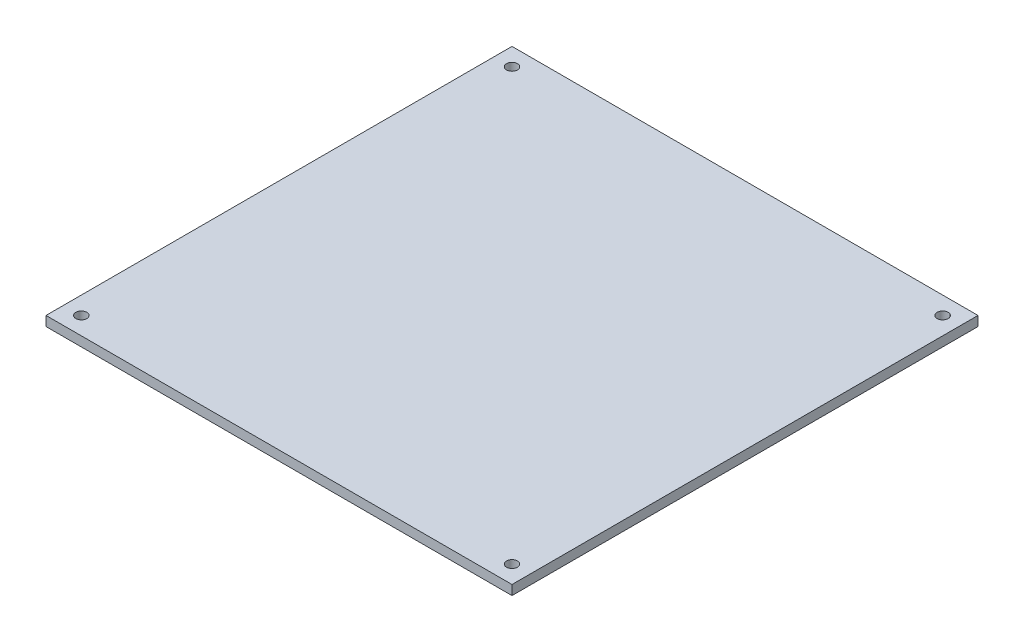
ISO-10303-21;
HEADER;
FILE_DESCRIPTION(('STEP AP214'),'2;1');
FILE_NAME('part.step','',(''),(''),'','','');
FILE_SCHEMA(('AUTOMOTIVE_DESIGN { 1 0 10303 214 1 1 1 1 }'));
ENDSEC;
DATA;
#1=APPLICATION_CONTEXT('core data for automotive mechanical design processes');
#2=APPLICATION_PROTOCOL_DEFINITION('international standard','automotive_design',2000,#1);
#3=PRODUCT_CONTEXT('',#1,'mechanical');
#4=PRODUCT('Part','Part','',(#3));
#5=PRODUCT_RELATED_PRODUCT_CATEGORY('part','',(#4));
#6=PRODUCT_DEFINITION_FORMATION('','',#4);
#7=PRODUCT_DEFINITION_CONTEXT('part definition',#1,'design');
#8=PRODUCT_DEFINITION('design','',#6,#7);
#9=PRODUCT_DEFINITION_SHAPE('','',#8);
#10=(LENGTH_UNIT() NAMED_UNIT(*) SI_UNIT(.MILLI.,.METRE.));
#11=(NAMED_UNIT(*) PLANE_ANGLE_UNIT() SI_UNIT($,.RADIAN.));
#12=(NAMED_UNIT(*) SI_UNIT($,.STERADIAN.) SOLID_ANGLE_UNIT());
#13=UNCERTAINTY_MEASURE_WITH_UNIT(LENGTH_MEASURE(1.E-05),#10,'distance_accuracy_value','');
#14=(GEOMETRIC_REPRESENTATION_CONTEXT(3) GLOBAL_UNCERTAINTY_ASSIGNED_CONTEXT((#13)) GLOBAL_UNIT_ASSIGNED_CONTEXT((#10,
#11,#12)) REPRESENTATION_CONTEXT('',''));
#15=CARTESIAN_POINT('',(0.,0.,0.));
#16=DIRECTION('',(0.,0.,1.));
#17=DIRECTION('',(1.,0.,0.));
#18=AXIS2_PLACEMENT_3D('',#15,#16,#17);
#19=CARTESIAN_POINT('',(0.,3.,0.));
#20=DIRECTION('',(1.,0.,0.));
#21=DIRECTION('',(0.,0.,-1.));
#22=AXIS2_PLACEMENT_3D('',#19,#20,#21);
#23=PLANE('',#22);
#24=DIRECTION('',(0.,0.,1.));
#25=VECTOR('',#24,1.);
#26=CARTESIAN_POINT('',(0.,0.,0.));
#27=LINE('',#26,#25);
#28=CARTESIAN_POINT('',(0.,0.,-145.));
#29=VERTEX_POINT('',#28);
#30=CARTESIAN_POINT('',(0.,0.,0.));
#31=VERTEX_POINT('',#30);
#32=EDGE_CURVE('E96',#29,#31,#27,.T.);
#33=ORIENTED_EDGE('',*,*,#32,.T.);
#34=DIRECTION('',(0.,-1.,0.));
#35=VECTOR('',#34,1.);
#36=CARTESIAN_POINT('',(0.,3.,0.));
#37=LINE('',#36,#35);
#38=CARTESIAN_POINT('',(0.,3.,0.));
#39=VERTEX_POINT('',#38);
#40=EDGE_CURVE('E11',#39,#31,#37,.T.);
#41=ORIENTED_EDGE('',*,*,#40,.F.);
#42=DIRECTION('',(0.,0.,1.));
#43=VECTOR('',#42,1.);
#44=CARTESIAN_POINT('',(0.,3.,0.));
#45=LINE('',#44,#43);
#46=CARTESIAN_POINT('',(0.,3.,-145.));
#47=VERTEX_POINT('',#46);
#48=EDGE_CURVE('E84',#47,#39,#45,.T.);
#49=ORIENTED_EDGE('',*,*,#48,.F.);
#50=DIRECTION('',(0.,-1.,0.));
#51=VECTOR('',#50,1.);
#52=CARTESIAN_POINT('',(0.,3.,-145.));
#53=LINE('',#52,#51);
#54=EDGE_CURVE('E92',#47,#29,#53,.T.);
#55=ORIENTED_EDGE('',*,*,#54,.T.);
#56=EDGE_LOOP('',(#33,#41,#49,#55));
#57=FACE_BOUND('',#56,.T.);
#58=ADVANCED_FACE('F33',(#57),#23,.F.);
#59=CARTESIAN_POINT('',(0.,3.,0.));
#60=DIRECTION('',(0.,0.,-1.));
#61=DIRECTION('',(-1.,0.,0.));
#62=AXIS2_PLACEMENT_3D('',#59,#60,#61);
#63=PLANE('',#62);
#64=DIRECTION('',(1.,0.,0.));
#65=VECTOR('',#64,1.);
#66=CARTESIAN_POINT('',(0.,0.,0.));
#67=LINE('',#66,#65);
#68=CARTESIAN_POINT('',(145.,0.,0.));
#69=VERTEX_POINT('',#68);
#70=EDGE_CURVE('E88',#31,#69,#67,.T.);
#71=ORIENTED_EDGE('',*,*,#70,.T.);
#72=DIRECTION('',(0.,-1.,0.));
#73=VECTOR('',#72,1.);
#74=CARTESIAN_POINT('',(145.,3.,0.));
#75=LINE('',#74,#73);
#76=CARTESIAN_POINT('',(145.,3.,0.));
#77=VERTEX_POINT('',#76);
#78=EDGE_CURVE('E41',#77,#69,#75,.T.);
#79=ORIENTED_EDGE('',*,*,#78,.F.);
#80=DIRECTION('',(1.,0.,0.));
#81=VECTOR('',#80,1.);
#82=CARTESIAN_POINT('',(0.,3.,0.));
#83=LINE('',#82,#81);
#84=EDGE_CURVE('E79',#39,#77,#83,.T.);
#85=ORIENTED_EDGE('',*,*,#84,.F.);
#86=ORIENTED_EDGE('',*,*,#40,.T.);
#87=EDGE_LOOP('',(#71,#79,#85,#86));
#88=FACE_BOUND('',#87,.T.);
#89=ADVANCED_FACE('F87',(#88),#63,.F.);
#90=CARTESIAN_POINT('',(145.,3.,0.));
#91=DIRECTION('',(-1.,0.,0.));
#92=DIRECTION('',(0.,0.,1.));
#93=AXIS2_PLACEMENT_3D('',#90,#91,#92);
#94=PLANE('',#93);
#95=DIRECTION('',(0.,0.,-1.));
#96=VECTOR('',#95,1.);
#97=CARTESIAN_POINT('',(145.,0.,0.));
#98=LINE('',#97,#96);
#99=CARTESIAN_POINT('',(145.,0.,-145.));
#100=VERTEX_POINT('',#99);
#101=EDGE_CURVE('E66',#69,#100,#98,.T.);
#102=ORIENTED_EDGE('',*,*,#101,.T.);
#103=DIRECTION('',(0.,-1.,0.));
#104=VECTOR('',#103,1.);
#105=CARTESIAN_POINT('',(145.,3.,-145.));
#106=LINE('',#105,#104);
#107=CARTESIAN_POINT('',(145.,3.,-145.));
#108=VERTEX_POINT('',#107);
#109=EDGE_CURVE('E89',#108,#100,#106,.T.);
#110=ORIENTED_EDGE('',*,*,#109,.F.);
#111=DIRECTION('',(0.,0.,-1.));
#112=VECTOR('',#111,1.);
#113=CARTESIAN_POINT('',(145.,3.,0.));
#114=LINE('',#113,#112);
#115=EDGE_CURVE('E82',#77,#108,#114,.T.);
#116=ORIENTED_EDGE('',*,*,#115,.F.);
#117=ORIENTED_EDGE('',*,*,#78,.T.);
#118=EDGE_LOOP('',(#102,#110,#116,#117));
#119=FACE_BOUND('',#118,.T.);
#120=ADVANCED_FACE('F90',(#119),#94,.F.);
#121=CARTESIAN_POINT('',(0.,3.,-145.));
#122=DIRECTION('',(0.,0.,1.));
#123=DIRECTION('',(1.,0.,0.));
#124=AXIS2_PLACEMENT_3D('',#121,#122,#123);
#125=PLANE('',#124);
#126=DIRECTION('',(-1.,0.,0.));
#127=VECTOR('',#126,1.);
#128=CARTESIAN_POINT('',(0.,0.,-145.));
#129=LINE('',#128,#127);
#130=EDGE_CURVE('E72',#100,#29,#129,.T.);
#131=ORIENTED_EDGE('',*,*,#130,.T.);
#132=ORIENTED_EDGE('',*,*,#54,.F.);
#133=DIRECTION('',(-1.,0.,0.));
#134=VECTOR('',#133,1.);
#135=CARTESIAN_POINT('',(0.,3.,-145.));
#136=LINE('',#135,#134);
#137=EDGE_CURVE('E49',#108,#47,#136,.T.);
#138=ORIENTED_EDGE('',*,*,#137,.F.);
#139=ORIENTED_EDGE('',*,*,#109,.T.);
#140=EDGE_LOOP('',(#131,#132,#138,#139));
#141=FACE_BOUND('',#140,.T.);
#142=ADVANCED_FACE('F104',(#141),#125,.F.);
#143=CARTESIAN_POINT('',(0.,3.,0.));
#144=DIRECTION('',(0.,-1.,0.));
#145=DIRECTION('',(0.,0.,-1.));
#146=AXIS2_PLACEMENT_3D('',#143,#144,#145);
#147=PLANE('',#146);
#148=CARTESIAN_POINT('',(139.5,3.,-5.50000000000001));
#149=DIRECTION('',(0.,1.,0.));
#150=DIRECTION('',(0.,0.,-1.));
#151=AXIS2_PLACEMENT_3D('',#148,#149,#150);
#152=CIRCLE('',#151,1.705);
#153=CARTESIAN_POINT('',(139.5,3.,-7.20500000000001));
#154=VERTEX_POINT('',#153);
#155=EDGE_CURVE('E123',#154,#154,#152,.T.);
#156=ORIENTED_EDGE('',*,*,#155,.F.);
#157=EDGE_LOOP('',(#156));
#158=FACE_BOUND('',#157,.T.);
#159=CARTESIAN_POINT('',(5.50000000000002,3.,-139.5));
#160=DIRECTION('',(0.,1.,0.));
#161=DIRECTION('',(0.,0.,-1.));
#162=AXIS2_PLACEMENT_3D('',#159,#160,#161);
#163=CIRCLE('',#162,1.705);
#164=CARTESIAN_POINT('',(5.50000000000002,3.,-141.205));
#165=VERTEX_POINT('',#164);
#166=EDGE_CURVE('E116',#165,#165,#163,.T.);
#167=ORIENTED_EDGE('',*,*,#166,.F.);
#168=EDGE_LOOP('',(#167));
#169=FACE_BOUND('',#168,.T.);
#170=CARTESIAN_POINT('',(139.5,3.,-139.5));
#171=DIRECTION('',(0.,1.,0.));
#172=DIRECTION('',(0.,0.,1.));
#173=AXIS2_PLACEMENT_3D('',#170,#171,#172);
#174=CIRCLE('',#173,1.70500000000001);
#175=CARTESIAN_POINT('',(139.5,3.,-137.795));
#176=VERTEX_POINT('',#175);
#177=EDGE_CURVE('E128',#176,#176,#174,.T.);
#178=ORIENTED_EDGE('',*,*,#177,.F.);
#179=EDGE_LOOP('',(#178));
#180=FACE_BOUND('',#179,.T.);
#181=CARTESIAN_POINT('',(5.50000000000002,3.,-5.50000000000001));
#182=DIRECTION('',(0.,1.,0.));
#183=DIRECTION('',(0.,0.,1.));
#184=AXIS2_PLACEMENT_3D('',#181,#182,#183);
#185=CIRCLE('',#184,1.705);
#186=CARTESIAN_POINT('',(5.50000000000002,3.,-3.79500000000001));
#187=VERTEX_POINT('',#186);
#188=EDGE_CURVE('E110',#187,#187,#185,.T.);
#189=ORIENTED_EDGE('',*,*,#188,.F.);
#190=EDGE_LOOP('',(#189));
#191=FACE_BOUND('',#190,.T.);
#192=ORIENTED_EDGE('',*,*,#48,.T.);
#193=ORIENTED_EDGE('',*,*,#84,.T.);
#194=ORIENTED_EDGE('',*,*,#115,.T.);
#195=ORIENTED_EDGE('',*,*,#137,.T.);
#196=EDGE_LOOP('',(#192,#193,#194,#195));
#197=FACE_BOUND('',#196,.T.);
#198=ADVANCED_FACE('F80',(#158,#169,#180,#191,#197),#147,.F.);
#199=CARTESIAN_POINT('',(0.,0.,0.));
#200=DIRECTION('',(0.,-1.,0.));
#201=DIRECTION('',(0.,0.,-1.));
#202=AXIS2_PLACEMENT_3D('',#199,#200,#201);
#203=PLANE('',#202);
#204=CARTESIAN_POINT('',(139.5,0.,-5.50000000000001));
#205=DIRECTION('',(0.,1.,0.));
#206=DIRECTION('',(0.,0.,-1.));
#207=AXIS2_PLACEMENT_3D('',#204,#205,#206);
#208=CIRCLE('',#207,1.705);
#209=CARTESIAN_POINT('',(139.5,0.,-7.20500000000001));
#210=VERTEX_POINT('',#209);
#211=EDGE_CURVE('E113',#210,#210,#208,.T.);
#212=ORIENTED_EDGE('',*,*,#211,.T.);
#213=EDGE_LOOP('',(#212));
#214=FACE_BOUND('',#213,.T.);
#215=CARTESIAN_POINT('',(5.50000000000002,0.,-139.5));
#216=DIRECTION('',(0.,1.,0.));
#217=DIRECTION('',(0.,0.,-1.));
#218=AXIS2_PLACEMENT_3D('',#215,#216,#217);
#219=CIRCLE('',#218,1.705);
#220=CARTESIAN_POINT('',(5.50000000000002,0.,-141.205));
#221=VERTEX_POINT('',#220);
#222=EDGE_CURVE('E119',#221,#221,#219,.T.);
#223=ORIENTED_EDGE('',*,*,#222,.T.);
#224=EDGE_LOOP('',(#223));
#225=FACE_BOUND('',#224,.T.);
#226=CARTESIAN_POINT('',(139.5,0.,-139.5));
#227=DIRECTION('',(0.,1.,0.));
#228=DIRECTION('',(0.,0.,1.));
#229=AXIS2_PLACEMENT_3D('',#226,#227,#228);
#230=CIRCLE('',#229,1.70500000000001);
#231=CARTESIAN_POINT('',(139.5,0.,-137.795));
#232=VERTEX_POINT('',#231);
#233=EDGE_CURVE('E120',#232,#232,#230,.T.);
#234=ORIENTED_EDGE('',*,*,#233,.T.);
#235=EDGE_LOOP('',(#234));
#236=FACE_BOUND('',#235,.T.);
#237=CARTESIAN_POINT('',(5.50000000000002,0.,-5.50000000000001));
#238=DIRECTION('',(0.,1.,0.));
#239=DIRECTION('',(0.,0.,1.));
#240=AXIS2_PLACEMENT_3D('',#237,#238,#239);
#241=CIRCLE('',#240,1.705);
#242=CARTESIAN_POINT('',(5.50000000000002,0.,-3.79500000000001));
#243=VERTEX_POINT('',#242);
#244=EDGE_CURVE('E99',#243,#243,#241,.T.);
#245=ORIENTED_EDGE('',*,*,#244,.T.);
#246=EDGE_LOOP('',(#245));
#247=FACE_BOUND('',#246,.T.);
#248=ORIENTED_EDGE('',*,*,#32,.F.);
#249=ORIENTED_EDGE('',*,*,#130,.F.);
#250=ORIENTED_EDGE('',*,*,#101,.F.);
#251=ORIENTED_EDGE('',*,*,#70,.F.);
#252=EDGE_LOOP('',(#248,#249,#250,#251));
#253=FACE_BOUND('',#252,.T.);
#254=ADVANCED_FACE('F107',(#214,#225,#236,#247,#253),#203,.T.);
#255=CARTESIAN_POINT('',(5.50000000000002,0.,-5.50000000000001));
#256=DIRECTION('',(0.,1.,0.));
#257=DIRECTION('',(0.,0.,1.));
#258=AXIS2_PLACEMENT_3D('',#255,#256,#257);
#259=CYLINDRICAL_SURFACE('',#258,1.705);
#260=ORIENTED_EDGE('',*,*,#244,.F.);
#261=EDGE_LOOP('',(#260));
#262=FACE_BOUND('',#261,.T.);
#263=ORIENTED_EDGE('',*,*,#188,.T.);
#264=EDGE_LOOP('',(#263));
#265=FACE_BOUND('',#264,.T.);
#266=ADVANCED_FACE('F140',(#262,#265),#259,.F.);
#267=CARTESIAN_POINT('',(139.5,0.,-139.5));
#268=DIRECTION('',(0.,1.,0.));
#269=DIRECTION('',(0.,0.,1.));
#270=AXIS2_PLACEMENT_3D('',#267,#268,#269);
#271=CYLINDRICAL_SURFACE('',#270,1.70500000000001);
#272=ORIENTED_EDGE('',*,*,#233,.F.);
#273=EDGE_LOOP('',(#272));
#274=FACE_BOUND('',#273,.T.);
#275=ORIENTED_EDGE('',*,*,#177,.T.);
#276=EDGE_LOOP('',(#275));
#277=FACE_BOUND('',#276,.T.);
#278=ADVANCED_FACE('F136',(#274,#277),#271,.F.);
#279=CARTESIAN_POINT('',(5.50000000000002,0.,-139.5));
#280=DIRECTION('',(0.,1.,0.));
#281=DIRECTION('',(0.,0.,1.));
#282=AXIS2_PLACEMENT_3D('',#279,#280,#281);
#283=CYLINDRICAL_SURFACE('',#282,1.705);
#284=ORIENTED_EDGE('',*,*,#222,.F.);
#285=EDGE_LOOP('',(#284));
#286=FACE_BOUND('',#285,.T.);
#287=ORIENTED_EDGE('',*,*,#166,.T.);
#288=EDGE_LOOP('',(#287));
#289=FACE_BOUND('',#288,.T.);
#290=ADVANCED_FACE('F139',(#286,#289),#283,.F.);
#291=CARTESIAN_POINT('',(139.5,0.,-5.50000000000001));
#292=DIRECTION('',(0.,1.,0.));
#293=DIRECTION('',(0.,0.,1.));
#294=AXIS2_PLACEMENT_3D('',#291,#292,#293);
#295=CYLINDRICAL_SURFACE('',#294,1.705);
#296=ORIENTED_EDGE('',*,*,#211,.F.);
#297=EDGE_LOOP('',(#296));
#298=FACE_BOUND('',#297,.T.);
#299=ORIENTED_EDGE('',*,*,#155,.T.);
#300=EDGE_LOOP('',(#299));
#301=FACE_BOUND('',#300,.T.);
#302=ADVANCED_FACE('F203',(#298,#301),#295,.F.);
#303=CLOSED_SHELL('',(#58,#89,#120,#142,#198,#254,#266,#278,#290,#302));
#304=MANIFOLD_SOLID_BREP('B2',#303);
#305=ADVANCED_BREP_SHAPE_REPRESENTATION('',(#18,#304),#14);
#306=SHAPE_DEFINITION_REPRESENTATION(#9,#305);
ENDSEC;
END-ISO-10303-21;
